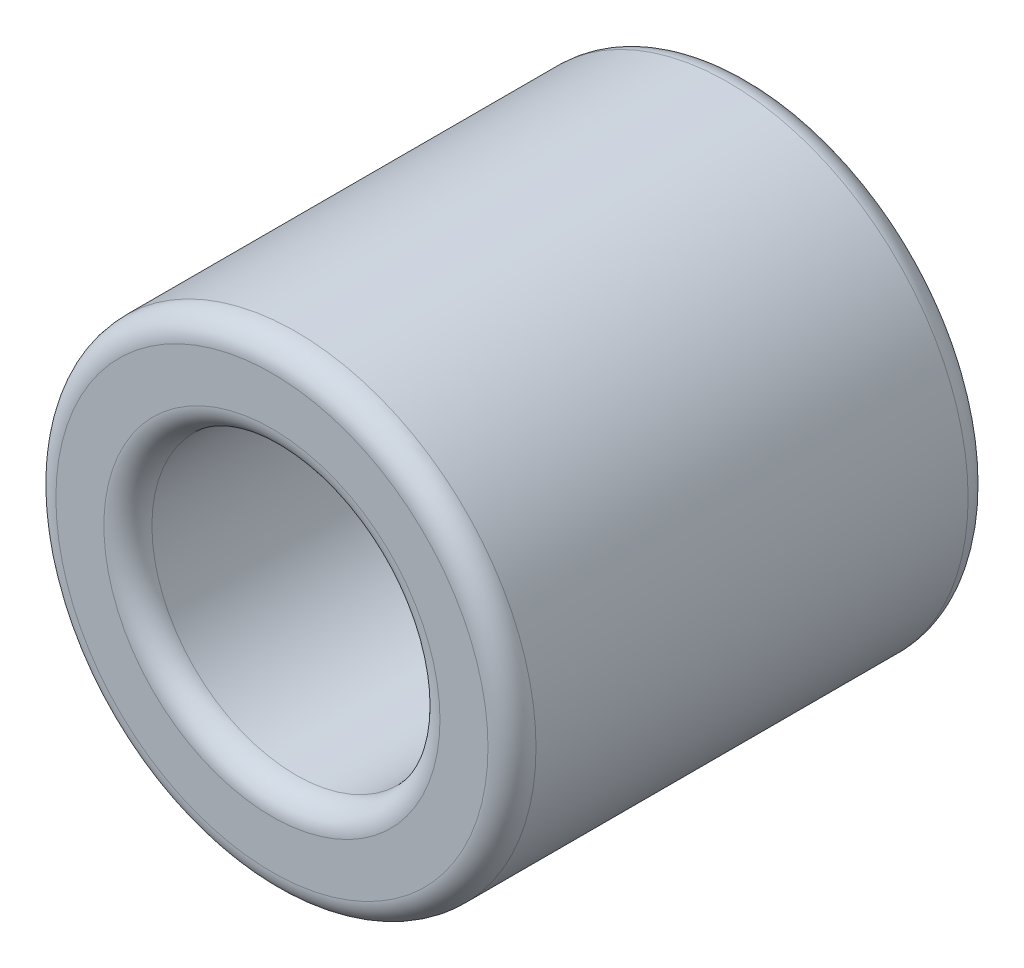
ISO-10303-21;
HEADER;
FILE_DESCRIPTION(('STEP AP214'),'2;1');
FILE_NAME('part.step','',(''),(''),'','','');
FILE_SCHEMA(('AUTOMOTIVE_DESIGN { 1 0 10303 214 1 1 1 1 }'));
ENDSEC;
DATA;
#1=APPLICATION_CONTEXT('core data for automotive mechanical design processes');
#2=APPLICATION_PROTOCOL_DEFINITION('international standard','automotive_design',2000,#1);
#3=PRODUCT_CONTEXT('',#1,'mechanical');
#4=PRODUCT('Part','Part','',(#3));
#5=PRODUCT_RELATED_PRODUCT_CATEGORY('part','',(#4));
#6=PRODUCT_DEFINITION_FORMATION('','',#4);
#7=PRODUCT_DEFINITION_CONTEXT('part definition',#1,'design');
#8=PRODUCT_DEFINITION('design','',#6,#7);
#9=PRODUCT_DEFINITION_SHAPE('','',#8);
#10=(LENGTH_UNIT() NAMED_UNIT(*) SI_UNIT(.MILLI.,.METRE.));
#11=(NAMED_UNIT(*) PLANE_ANGLE_UNIT() SI_UNIT($,.RADIAN.));
#12=(NAMED_UNIT(*) SI_UNIT($,.STERADIAN.) SOLID_ANGLE_UNIT());
#13=UNCERTAINTY_MEASURE_WITH_UNIT(LENGTH_MEASURE(1.E-05),#10,'distance_accuracy_value','');
#14=(GEOMETRIC_REPRESENTATION_CONTEXT(3) GLOBAL_UNCERTAINTY_ASSIGNED_CONTEXT((#13)) GLOBAL_UNIT_ASSIGNED_CONTEXT((#10,
#11,#12)) REPRESENTATION_CONTEXT('',''));
#15=CARTESIAN_POINT('',(0.,0.,0.));
#16=DIRECTION('',(0.,0.,1.));
#17=DIRECTION('',(1.,0.,0.));
#18=AXIS2_PLACEMENT_3D('',#15,#16,#17);
#19=CARTESIAN_POINT('',(0.,0.,10.));
#20=DIRECTION('',(0.,0.,1.));
#21=DIRECTION('',(1.,0.,0.));
#22=AXIS2_PLACEMENT_3D('',#19,#20,#21);
#23=PLANE('',#22);
#24=CARTESIAN_POINT('',(0.,0.,10.));
#25=DIRECTION('',(0.,0.,1.));
#26=DIRECTION('',(1.,0.,0.));
#27=AXIS2_PLACEMENT_3D('',#24,#25,#26);
#28=CIRCLE('',#27,3.5);
#29=CARTESIAN_POINT('',(3.5,0.,10.));
#30=VERTEX_POINT('',#29);
#31=EDGE_CURVE('E10',#30,#30,#28,.F.);
#32=ORIENTED_EDGE('',*,*,#31,.T.);
#33=EDGE_LOOP('',(#32));
#34=FACE_BOUND('',#33,.T.);
#35=CARTESIAN_POINT('',(0.,0.,10.));
#36=DIRECTION('',(0.,0.,1.));
#37=DIRECTION('',(1.,0.,0.));
#38=AXIS2_PLACEMENT_3D('',#35,#36,#37);
#39=CIRCLE('',#38,4.5);
#40=CARTESIAN_POINT('',(4.5,0.,10.));
#41=VERTEX_POINT('',#40);
#42=EDGE_CURVE('E41',#41,#41,#39,.T.);
#43=ORIENTED_EDGE('',*,*,#42,.T.);
#44=EDGE_LOOP('',(#43));
#45=FACE_BOUND('',#44,.T.);
#46=ADVANCED_FACE('F34',(#34,#45),#23,.T.);
#47=CARTESIAN_POINT('',(0.,0.,0.));
#48=DIRECTION('',(0.,0.,1.));
#49=DIRECTION('',(1.,0.,0.));
#50=AXIS2_PLACEMENT_3D('',#47,#48,#49);
#51=PLANE('',#50);
#52=CARTESIAN_POINT('',(0.,0.,0.));
#53=DIRECTION('',(0.,0.,1.));
#54=DIRECTION('',(1.,0.,0.));
#55=AXIS2_PLACEMENT_3D('',#52,#53,#54);
#56=CIRCLE('',#55,4.5);
#57=CARTESIAN_POINT('',(4.5,0.,0.));
#58=VERTEX_POINT('',#57);
#59=EDGE_CURVE('E54',#58,#58,#56,.F.);
#60=ORIENTED_EDGE('',*,*,#59,.T.);
#61=EDGE_LOOP('',(#60));
#62=FACE_BOUND('',#61,.T.);
#63=CARTESIAN_POINT('',(0.,0.,0.));
#64=DIRECTION('',(0.,0.,1.));
#65=DIRECTION('',(1.,0.,0.));
#66=AXIS2_PLACEMENT_3D('',#63,#64,#65);
#67=CIRCLE('',#66,3.5);
#68=CARTESIAN_POINT('',(3.5,0.,0.));
#69=VERTEX_POINT('',#68);
#70=EDGE_CURVE('E57',#69,#69,#67,.T.);
#71=ORIENTED_EDGE('',*,*,#70,.T.);
#72=EDGE_LOOP('',(#71));
#73=FACE_BOUND('',#72,.T.);
#74=ADVANCED_FACE('F78',(#62,#73),#51,.F.);
#75=CARTESIAN_POINT('',(0.,0.,10.));
#76=DIRECTION('',(0.,0.,-1.));
#77=DIRECTION('',(-1.,0.,0.));
#78=AXIS2_PLACEMENT_3D('',#75,#76,#77);
#79=CYLINDRICAL_SURFACE('',#78,5.);
#80=CARTESIAN_POINT('',(0.,0.,0.5));
#81=DIRECTION('',(0.,0.,1.));
#82=DIRECTION('',(1.,0.,0.));
#83=AXIS2_PLACEMENT_3D('',#80,#81,#82);
#84=CIRCLE('',#83,5.);
#85=CARTESIAN_POINT('',(5.,0.,0.5));
#86=VERTEX_POINT('',#85);
#87=EDGE_CURVE('E60',#86,#86,#84,.T.);
#88=ORIENTED_EDGE('',*,*,#87,.T.);
#89=EDGE_LOOP('',(#88));
#90=FACE_BOUND('',#89,.T.);
#91=CARTESIAN_POINT('',(0.,0.,9.5));
#92=DIRECTION('',(0.,0.,1.));
#93=DIRECTION('',(1.,0.,0.));
#94=AXIS2_PLACEMENT_3D('',#91,#92,#93);
#95=CIRCLE('',#94,5.);
#96=CARTESIAN_POINT('',(5.,0.,9.5));
#97=VERTEX_POINT('',#96);
#98=EDGE_CURVE('E63',#97,#97,#95,.F.);
#99=ORIENTED_EDGE('',*,*,#98,.T.);
#100=EDGE_LOOP('',(#99));
#101=FACE_BOUND('',#100,.T.);
#102=ADVANCED_FACE('F67',(#90,#101),#79,.T.);
#103=CARTESIAN_POINT('',(0.,0.,10.));
#104=DIRECTION('',(0.,0.,-1.));
#105=DIRECTION('',(-1.,0.,0.));
#106=AXIS2_PLACEMENT_3D('',#103,#104,#105);
#107=CYLINDRICAL_SURFACE('',#106,3.);
#108=CARTESIAN_POINT('',(0.,0.,0.5));
#109=DIRECTION('',(0.,0.,1.));
#110=DIRECTION('',(1.,0.,0.));
#111=AXIS2_PLACEMENT_3D('',#108,#109,#110);
#112=CIRCLE('',#111,3.);
#113=CARTESIAN_POINT('',(3.,0.,0.5));
#114=VERTEX_POINT('',#113);
#115=EDGE_CURVE('E45',#114,#114,#112,.F.);
#116=ORIENTED_EDGE('',*,*,#115,.T.);
#117=EDGE_LOOP('',(#116));
#118=FACE_BOUND('',#117,.T.);
#119=CARTESIAN_POINT('',(0.,0.,9.5));
#120=DIRECTION('',(0.,0.,1.));
#121=DIRECTION('',(1.,0.,0.));
#122=AXIS2_PLACEMENT_3D('',#119,#120,#121);
#123=CIRCLE('',#122,3.);
#124=CARTESIAN_POINT('',(3.,0.,9.5));
#125=VERTEX_POINT('',#124);
#126=EDGE_CURVE('E49',#125,#125,#123,.T.);
#127=ORIENTED_EDGE('',*,*,#126,.T.);
#128=EDGE_LOOP('',(#127));
#129=FACE_BOUND('',#128,.T.);
#130=ADVANCED_FACE('F86',(#118,#129),#107,.F.);
#131=CARTESIAN_POINT('',(0.,0.,0.5));
#132=DIRECTION('',(0.,0.,1.));
#133=DIRECTION('',(1.,0.,0.));
#134=AXIS2_PLACEMENT_3D('',#131,#132,#133);
#135=TOROIDAL_SURFACE('',#134,4.5,0.5);
#136=ORIENTED_EDGE('',*,*,#59,.F.);
#137=EDGE_LOOP('',(#136));
#138=FACE_BOUND('',#137,.T.);
#139=ORIENTED_EDGE('',*,*,#87,.F.);
#140=EDGE_LOOP('',(#139));
#141=FACE_BOUND('',#140,.T.);
#142=ADVANCED_FACE('F91',(#138,#141),#135,.T.);
#143=CARTESIAN_POINT('',(0.,0.,0.5));
#144=DIRECTION('',(0.,0.,1.));
#145=DIRECTION('',(1.,0.,0.));
#146=AXIS2_PLACEMENT_3D('',#143,#144,#145);
#147=TOROIDAL_SURFACE('',#146,3.5,0.5);
#148=ORIENTED_EDGE('',*,*,#115,.F.);
#149=EDGE_LOOP('',(#148));
#150=FACE_BOUND('',#149,.T.);
#151=ORIENTED_EDGE('',*,*,#70,.F.);
#152=EDGE_LOOP('',(#151));
#153=FACE_BOUND('',#152,.T.);
#154=ADVANCED_FACE('F75',(#150,#153),#147,.T.);
#155=CARTESIAN_POINT('',(0.,0.,9.5));
#156=DIRECTION('',(0.,0.,1.));
#157=DIRECTION('',(1.,0.,0.));
#158=AXIS2_PLACEMENT_3D('',#155,#156,#157);
#159=TOROIDAL_SURFACE('',#158,3.5,0.5);
#160=ORIENTED_EDGE('',*,*,#31,.F.);
#161=EDGE_LOOP('',(#160));
#162=FACE_BOUND('',#161,.T.);
#163=ORIENTED_EDGE('',*,*,#126,.F.);
#164=EDGE_LOOP('',(#163));
#165=FACE_BOUND('',#164,.T.);
#166=ADVANCED_FACE('F71',(#162,#165),#159,.T.);
#167=CARTESIAN_POINT('',(0.,0.,9.5));
#168=DIRECTION('',(0.,0.,1.));
#169=DIRECTION('',(1.,0.,0.));
#170=AXIS2_PLACEMENT_3D('',#167,#168,#169);
#171=TOROIDAL_SURFACE('',#170,4.5,0.5);
#172=ORIENTED_EDGE('',*,*,#98,.F.);
#173=EDGE_LOOP('',(#172));
#174=FACE_BOUND('',#173,.T.);
#175=ORIENTED_EDGE('',*,*,#42,.F.);
#176=EDGE_LOOP('',(#175));
#177=FACE_BOUND('',#176,.T.);
#178=ADVANCED_FACE('F36',(#174,#177),#171,.T.);
#179=CLOSED_SHELL('',(#46,#74,#102,#130,#142,#154,#166,#178));
#180=MANIFOLD_SOLID_BREP('B2',#179);
#181=ADVANCED_BREP_SHAPE_REPRESENTATION('',(#18,#180),#14);
#182=SHAPE_DEFINITION_REPRESENTATION(#9,#181);
ENDSEC;
END-ISO-10303-21;
